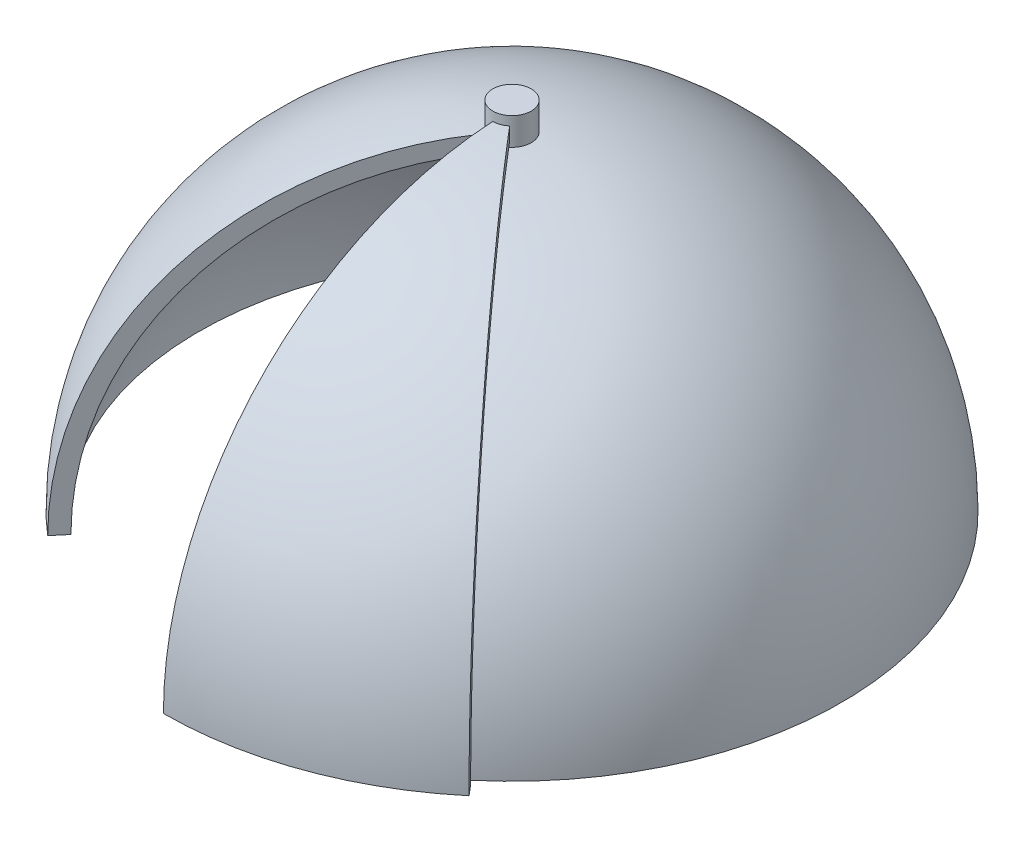
ISO-10303-21;
HEADER;
FILE_DESCRIPTION(('STEP AP214'),'2;1');
FILE_NAME('part.step','',(''),(''),'','','');
FILE_SCHEMA(('AUTOMOTIVE_DESIGN { 1 0 10303 214 1 1 1 1 }'));
ENDSEC;
DATA;
#1=APPLICATION_CONTEXT('core data for automotive mechanical design processes');
#2=APPLICATION_PROTOCOL_DEFINITION('international standard','automotive_design',2000,#1);
#3=PRODUCT_CONTEXT('',#1,'mechanical');
#4=PRODUCT('Part','Part','',(#3));
#5=PRODUCT_RELATED_PRODUCT_CATEGORY('part','',(#4));
#6=PRODUCT_DEFINITION_FORMATION('','',#4);
#7=PRODUCT_DEFINITION_CONTEXT('part definition',#1,'design');
#8=PRODUCT_DEFINITION('design','',#6,#7);
#9=PRODUCT_DEFINITION_SHAPE('','',#8);
#10=(LENGTH_UNIT() NAMED_UNIT(*) SI_UNIT(.MILLI.,.METRE.));
#11=(NAMED_UNIT(*) PLANE_ANGLE_UNIT() SI_UNIT($,.RADIAN.));
#12=(NAMED_UNIT(*) SI_UNIT($,.STERADIAN.) SOLID_ANGLE_UNIT());
#13=UNCERTAINTY_MEASURE_WITH_UNIT(LENGTH_MEASURE(1.E-05),#10,'distance_accuracy_value','');
#14=(GEOMETRIC_REPRESENTATION_CONTEXT(3) GLOBAL_UNCERTAINTY_ASSIGNED_CONTEXT((#13)) GLOBAL_UNIT_ASSIGNED_CONTEXT((#10,
#11,#12)) REPRESENTATION_CONTEXT('',''));
#15=CARTESIAN_POINT('',(0.,0.,0.));
#16=DIRECTION('',(0.,0.,1.));
#17=DIRECTION('',(1.,0.,0.));
#18=AXIS2_PLACEMENT_3D('',#15,#16,#17);
#19=CARTESIAN_POINT('',(0.,0.,0.));
#20=DIRECTION('',(0.,-1.,0.));
#21=DIRECTION('',(0.64278760968654,0.,0.766044443118977));
#22=AXIS2_PLACEMENT_3D('',#19,#20,#21);
#23=SPHERICAL_SURFACE('',#22,12210.9780211331);
#24=CARTESIAN_POINT('',(4.79826286122826E-13,12190.8975974944,-5.71834700308029E-13));
#25=DIRECTION('',(0.,-1.,0.));
#26=DIRECTION('',(0.,0.,-1.));
#27=AXIS2_PLACEMENT_3D('',#24,#25,#26);
#28=CIRCLE('',#27,700.);
#29=CARTESIAN_POINT('',(449.951326780579,12190.8975974944,536.231110183283));
#30=VERTEX_POINT('',#29);
#31=CARTESIAN_POINT('',(4.79826286122826E-13,12190.8975974944,699.999999999999));
#32=VERTEX_POINT('',#31);
#33=EDGE_CURVE('E78',#30,#32,#28,.T.);
#34=ORIENTED_EDGE('',*,*,#33,.F.);
#35=CARTESIAN_POINT('',(0.,0.,0.));
#36=DIRECTION('',(-0.766044443118977,0.,0.64278760968654));
#37=DIRECTION('',(-0.64278760968654,0.,-0.766044443118977));
#38=AXIS2_PLACEMENT_3D('',#35,#36,#37);
#39=CIRCLE('',#38,12210.9780211331);
#40=CARTESIAN_POINT('',(7849.065374139,0.,9354.15185813694));
#41=VERTEX_POINT('',#40);
#42=EDGE_CURVE('E122',#41,#30,#39,.T.);
#43=ORIENTED_EDGE('',*,*,#42,.F.);
#44=CARTESIAN_POINT('',(0.,0.,0.));
#45=DIRECTION('',(0.,-1.,0.));
#46=DIRECTION('',(0.,0.,-1.));
#47=AXIS2_PLACEMENT_3D('',#44,#45,#46);
#48=CIRCLE('',#47,12210.9780211331);
#49=CARTESIAN_POINT('',(0.,0.,12210.9780211331));
#50=VERTEX_POINT('',#49);
#51=EDGE_CURVE('E128',#41,#50,#48,.T.);
#52=ORIENTED_EDGE('',*,*,#51,.T.);
#53=CARTESIAN_POINT('',(0.,0.,0.));
#54=DIRECTION('',(-1.,0.,0.));
#55=DIRECTION('',(0.,0.,-1.));
#56=AXIS2_PLACEMENT_3D('',#53,#54,#55);
#57=CIRCLE('',#56,12210.9780211331);
#58=EDGE_CURVE('E106',#50,#32,#57,.T.);
#59=ORIENTED_EDGE('',*,*,#58,.T.);
#60=EDGE_LOOP('',(#34,#43,#52,#59));
#61=FACE_BOUND('',#60,.T.);
#62=ADVANCED_FACE('F55',(#61),#23,.F.);
#63=CARTESIAN_POINT('',(0.,0.,0.));
#64=DIRECTION('',(0.,-1.,0.));
#65=DIRECTION('',(-0.64278760968654,0.,-0.766044443118977));
#66=AXIS2_PLACEMENT_3D('',#63,#64,#65);
#67=SPHERICAL_SURFACE('',#66,12693.1418998015);
#68=CARTESIAN_POINT('',(4.9883403115345E-13,12673.8254401935,-5.94487248735391E-13));
#69=DIRECTION('',(0.,-1.,0.));
#70=DIRECTION('',(0.,0.,-1.));
#71=AXIS2_PLACEMENT_3D('',#68,#69,#70);
#72=CIRCLE('',#71,700.);
#73=CARTESIAN_POINT('',(4.9883403115345E-13,12673.8254401935,699.999999999999));
#74=VERTEX_POINT('',#73);
#75=CARTESIAN_POINT('',(449.951326780579,12673.8254401935,536.231110183283));
#76=VERTEX_POINT('',#75);
#77=EDGE_CURVE('E109',#74,#76,#72,.F.);
#78=ORIENTED_EDGE('',*,*,#77,.F.);
#79=CARTESIAN_POINT('',(0.,0.,0.));
#80=DIRECTION('',(1.,0.,0.));
#81=DIRECTION('',(0.,0.,-1.));
#82=AXIS2_PLACEMENT_3D('',#79,#80,#81);
#83=CIRCLE('',#82,12693.1418998015);
#84=CARTESIAN_POINT('',(0.,0.,12693.1418998015));
#85=VERTEX_POINT('',#84);
#86=EDGE_CURVE('E97',#74,#85,#83,.T.);
#87=ORIENTED_EDGE('',*,*,#86,.T.);
#88=CARTESIAN_POINT('',(0.,0.,0.));
#89=DIRECTION('',(0.,-1.,0.));
#90=DIRECTION('',(0.,0.,-1.));
#91=AXIS2_PLACEMENT_3D('',#88,#89,#90);
#92=CIRCLE('',#91,12693.1418998015);
#93=CARTESIAN_POINT('',(8158.99434118547,0.,9723.51081806358));
#94=VERTEX_POINT('',#93);
#95=EDGE_CURVE('E63',#94,#85,#92,.T.);
#96=ORIENTED_EDGE('',*,*,#95,.F.);
#97=CARTESIAN_POINT('',(0.,0.,0.));
#98=DIRECTION('',(0.766044443118977,0.,-0.64278760968654));
#99=DIRECTION('',(-0.64278760968654,0.,-0.766044443118977));
#100=AXIS2_PLACEMENT_3D('',#97,#98,#99);
#101=CIRCLE('',#100,12693.1418998015);
#102=EDGE_CURVE('E110',#76,#94,#101,.T.);
#103=ORIENTED_EDGE('',*,*,#102,.F.);
#104=EDGE_LOOP('',(#78,#87,#96,#103));
#105=FACE_BOUND('',#104,.T.);
#106=ADVANCED_FACE('F57',(#105),#67,.T.);
#107=CARTESIAN_POINT('',(0.,0.,0.));
#108=DIRECTION('',(0.766044443118977,0.,-0.64278760968654));
#109=DIRECTION('',(-0.64278760968654,0.,-0.766044443118977));
#110=AXIS2_PLACEMENT_3D('',#107,#108,#109);
#111=PLANE('',#110);
#112=ORIENTED_EDGE('',*,*,#42,.T.);
#113=DIRECTION('',(0.,-1.,0.));
#114=VECTOR('',#113,1.);
#115=CARTESIAN_POINT('',(449.951326780578,13000.,536.231110183284));
#116=LINE('',#115,#114);
#117=EDGE_CURVE('E70',#30,#76,#116,.F.);
#118=ORIENTED_EDGE('',*,*,#117,.T.);
#119=ORIENTED_EDGE('',*,*,#102,.T.);
#120=DIRECTION('',(-0.64278760968654,0.,-0.766044443118977));
#121=VECTOR('',#120,1.);
#122=CARTESIAN_POINT('',(7849.065374139,0.,9354.15185813694));
#123=LINE('',#122,#121);
#124=EDGE_CURVE('E125',#94,#41,#123,.T.);
#125=ORIENTED_EDGE('',*,*,#124,.T.);
#126=EDGE_LOOP('',(#112,#118,#119,#125));
#127=FACE_BOUND('',#126,.T.);
#128=ADVANCED_FACE('F132',(#127),#111,.T.);
#129=CARTESIAN_POINT('',(0.,0.,0.));
#130=DIRECTION('',(1.,0.,0.));
#131=DIRECTION('',(0.,0.,-1.));
#132=AXIS2_PLACEMENT_3D('',#129,#130,#131);
#133=PLANE('',#132);
#134=DIRECTION('',(0.,-1.,0.));
#135=VECTOR('',#134,1.);
#136=CARTESIAN_POINT('',(0.,13000.,699.999999999999));
#137=LINE('',#136,#135);
#138=EDGE_CURVE('E12',#32,#74,#137,.F.);
#139=ORIENTED_EDGE('',*,*,#138,.F.);
#140=ORIENTED_EDGE('',*,*,#58,.F.);
#141=DIRECTION('',(0.,0.,-1.));
#142=VECTOR('',#141,1.);
#143=CARTESIAN_POINT('',(0.,0.,12210.9780211331));
#144=LINE('',#143,#142);
#145=EDGE_CURVE('E102',#85,#50,#144,.T.);
#146=ORIENTED_EDGE('',*,*,#145,.F.);
#147=ORIENTED_EDGE('',*,*,#86,.F.);
#148=EDGE_LOOP('',(#139,#140,#146,#147));
#149=FACE_BOUND('',#148,.T.);
#150=ADVANCED_FACE('F99',(#149),#133,.F.);
#151=CARTESIAN_POINT('',(7849.065374139,0.,9354.15185813694));
#152=DIRECTION('',(0.,1.,0.));
#153=DIRECTION('',(0.,0.,1.));
#154=AXIS2_PLACEMENT_3D('',#151,#152,#153);
#155=PLANE('',#154);
#156=ORIENTED_EDGE('',*,*,#124,.F.);
#157=ORIENTED_EDGE('',*,*,#95,.T.);
#158=ORIENTED_EDGE('',*,*,#145,.T.);
#159=ORIENTED_EDGE('',*,*,#51,.F.);
#160=EDGE_LOOP('',(#156,#157,#158,#159));
#161=FACE_BOUND('',#160,.T.);
#162=ADVANCED_FACE('F131',(#161),#155,.F.);
#163=CARTESIAN_POINT('',(5.11672062677222E-13,13000.,-6.09787018925683E-13));
#164=DIRECTION('',(0.,-1.,0.));
#165=DIRECTION('',(0.,0.,-1.));
#166=AXIS2_PLACEMENT_3D('',#163,#164,#165);
#167=CYLINDRICAL_SURFACE('',#166,700.);
#168=ORIENTED_EDGE('',*,*,#117,.F.);
#169=ORIENTED_EDGE('',*,*,#33,.T.);
#170=ORIENTED_EDGE('',*,*,#138,.T.);
#171=ORIENTED_EDGE('',*,*,#77,.T.);
#172=EDGE_LOOP('',(#168,#169,#170,#171));
#173=FACE_BOUND('',#172,.T.);
#174=CARTESIAN_POINT('',(5.11672062677222E-13,13000.,-6.09787018925683E-13));
#175=DIRECTION('',(0.,1.,0.));
#176=DIRECTION('',(0.,0.,1.));
#177=AXIS2_PLACEMENT_3D('',#174,#175,#176);
#178=CIRCLE('',#177,700.);
#179=CARTESIAN_POINT('',(5.11672062677222E-13,13000.,699.999999999999));
#180=VERTEX_POINT('',#179);
#181=EDGE_CURVE('E112',#180,#180,#178,.T.);
#182=ORIENTED_EDGE('',*,*,#181,.F.);
#183=EDGE_LOOP('',(#182));
#184=FACE_BOUND('',#183,.T.);
#185=CARTESIAN_POINT('',(4.72312673240512E-13,12000.,-5.62880325162169E-13));
#186=DIRECTION('',(0.,1.,0.));
#187=DIRECTION('',(0.,0.,1.));
#188=AXIS2_PLACEMENT_3D('',#185,#186,#187);
#189=CIRCLE('',#188,700.);
#190=CARTESIAN_POINT('',(4.72312673240512E-13,12000.,699.999999999999));
#191=VERTEX_POINT('',#190);
#192=EDGE_CURVE('E161',#191,#191,#189,.T.);
#193=ORIENTED_EDGE('',*,*,#192,.T.);
#194=EDGE_LOOP('',(#193));
#195=FACE_BOUND('',#194,.T.);
#196=ADVANCED_FACE('F114',(#173,#184,#195),#167,.T.);
#197=CARTESIAN_POINT('',(5.11672062677222E-13,13000.,-6.09787018925683E-13));
#198=DIRECTION('',(0.,1.,0.));
#199=DIRECTION('',(0.,0.,1.));
#200=AXIS2_PLACEMENT_3D('',#197,#198,#199);
#201=PLANE('',#200);
#202=ORIENTED_EDGE('',*,*,#181,.T.);
#203=EDGE_LOOP('',(#202));
#204=FACE_BOUND('',#203,.T.);
#205=ADVANCED_FACE('F144',(#204),#201,.T.);
#206=CARTESIAN_POINT('',(4.72312673240512E-13,12000.,-5.62880325162169E-13));
#207=DIRECTION('',(0.,1.,0.));
#208=DIRECTION('',(0.,0.,1.));
#209=AXIS2_PLACEMENT_3D('',#206,#207,#208);
#210=PLANE('',#209);
#211=ORIENTED_EDGE('',*,*,#192,.F.);
#212=EDGE_LOOP('',(#211));
#213=FACE_BOUND('',#212,.T.);
#214=ADVANCED_FACE('F151',(#213),#210,.F.);
#215=CLOSED_SHELL('',(#62,#106,#128,#150,#162,#196,#205,#214));
#216=MANIFOLD_SOLID_BREP('B2',#215);
#217=CARTESIAN_POINT('',(0.,0.,0.));
#218=DIRECTION('',(0.,-1.,0.));
#219=DIRECTION('',(-0.64278760968653,0.,0.766044443118986));
#220=AXIS2_PLACEMENT_3D('',#217,#218,#219);
#221=SPHERICAL_SURFACE('',#220,11400.);
#222=CARTESIAN_POINT('',(0.,0.,0.));
#223=DIRECTION('',(-1.,0.,0.));
#224=DIRECTION('',(0.,0.,-1.));
#225=AXIS2_PLACEMENT_3D('',#222,#223,#224);
#226=CIRCLE('',#225,11400.);
#227=CARTESIAN_POINT('',(0.,0.,11400.));
#228=VERTEX_POINT('',#227);
#229=CARTESIAN_POINT('',(0.,11400.,0.));
#230=VERTEX_POINT('',#229);
#231=EDGE_CURVE('E251',#228,#230,#226,.T.);
#232=ORIENTED_EDGE('',*,*,#231,.T.);
#233=CARTESIAN_POINT('',(0.,0.,0.));
#234=DIRECTION('',(-0.766044443118986,0.,-0.64278760968653));
#235=DIRECTION('',(0.64278760968653,0.,-0.766044443118986));
#236=AXIS2_PLACEMENT_3D('',#233,#234,#235);
#237=CIRCLE('',#236,11400.);
#238=CARTESIAN_POINT('',(-7327.77875042644,0.,8732.90665155644));
#239=VERTEX_POINT('',#238);
#240=EDGE_CURVE('E257',#239,#230,#237,.T.);
#241=ORIENTED_EDGE('',*,*,#240,.F.);
#242=CARTESIAN_POINT('',(0.,0.,0.));
#243=DIRECTION('',(0.,-1.,0.));
#244=DIRECTION('',(0.,0.,-1.));
#245=AXIS2_PLACEMENT_3D('',#242,#243,#244);
#246=CIRCLE('',#245,11400.);
#247=EDGE_CURVE('E218',#239,#228,#246,.T.);
#248=ORIENTED_EDGE('',*,*,#247,.T.);
#249=EDGE_LOOP('',(#232,#241,#248));
#250=FACE_BOUND('',#249,.T.);
#251=ADVANCED_FACE('F209',(#250),#221,.F.);
#252=CARTESIAN_POINT('',(0.,0.,0.));
#253=DIRECTION('',(0.,-1.,0.));
#254=DIRECTION('',(0.64278760968653,0.,-0.766044443118986));
#255=AXIS2_PLACEMENT_3D('',#252,#253,#254);
#256=SPHERICAL_SURFACE('',#255,12000.);
#257=CARTESIAN_POINT('',(0.,0.,0.));
#258=DIRECTION('',(0.,-1.,0.));
#259=DIRECTION('',(0.,0.,-1.));
#260=AXIS2_PLACEMENT_3D('',#257,#258,#259);
#261=CIRCLE('',#260,12000.);
#262=CARTESIAN_POINT('',(-7713.45131623836,0.,9192.53331742783));
#263=VERTEX_POINT('',#262);
#264=CARTESIAN_POINT('',(0.,0.,12000.));
#265=VERTEX_POINT('',#264);
#266=EDGE_CURVE('E53',#263,#265,#261,.T.);
#267=ORIENTED_EDGE('',*,*,#266,.F.);
#268=CARTESIAN_POINT('',(0.,0.,0.));
#269=DIRECTION('',(0.766044443118986,0.,0.64278760968653));
#270=DIRECTION('',(0.64278760968653,0.,-0.766044443118986));
#271=AXIS2_PLACEMENT_3D('',#268,#269,#270);
#272=CIRCLE('',#271,12000.);
#273=CARTESIAN_POINT('',(4.72312673240512E-13,12000.,-5.6288032516217E-13));
#274=VERTEX_POINT('',#273);
#275=EDGE_CURVE('E247',#274,#263,#272,.T.);
#276=ORIENTED_EDGE('',*,*,#275,.F.);
#277=CARTESIAN_POINT('',(0.,0.,0.));
#278=DIRECTION('',(1.,0.,0.));
#279=DIRECTION('',(0.,0.,-1.));
#280=AXIS2_PLACEMENT_3D('',#277,#278,#279);
#281=CIRCLE('',#280,12000.);
#282=EDGE_CURVE('E246',#274,#265,#281,.T.);
#283=ORIENTED_EDGE('',*,*,#282,.T.);
#284=EDGE_LOOP('',(#267,#276,#283));
#285=FACE_BOUND('',#284,.T.);
#286=ADVANCED_FACE('F211',(#285),#256,.T.);
#287=CARTESIAN_POINT('',(-7327.77875042644,0.,8732.90665155644));
#288=DIRECTION('',(0.,1.,0.));
#289=DIRECTION('',(0.,0.,1.));
#290=AXIS2_PLACEMENT_3D('',#287,#288,#289);
#291=PLANE('',#290);
#292=DIRECTION('',(0.64278760968653,0.,-0.766044443118986));
#293=VECTOR('',#292,1.);
#294=CARTESIAN_POINT('',(-7327.77875042644,0.,8732.90665155644));
#295=LINE('',#294,#293);
#296=EDGE_CURVE('E245',#263,#239,#295,.T.);
#297=ORIENTED_EDGE('',*,*,#296,.F.);
#298=ORIENTED_EDGE('',*,*,#266,.T.);
#299=DIRECTION('',(0.,0.,-1.));
#300=VECTOR('',#299,1.);
#301=CARTESIAN_POINT('',(0.,0.,11400.));
#302=LINE('',#301,#300);
#303=EDGE_CURVE('E243',#265,#228,#302,.T.);
#304=ORIENTED_EDGE('',*,*,#303,.T.);
#305=ORIENTED_EDGE('',*,*,#247,.F.);
#306=EDGE_LOOP('',(#297,#298,#304,#305));
#307=FACE_BOUND('',#306,.T.);
#308=ADVANCED_FACE('F241',(#307),#291,.F.);
#309=CARTESIAN_POINT('',(0.,0.,0.));
#310=DIRECTION('',(0.766044443118986,0.,0.64278760968653));
#311=DIRECTION('',(0.64278760968653,0.,-0.766044443118986));
#312=AXIS2_PLACEMENT_3D('',#309,#310,#311);
#313=PLANE('',#312);
#314=ORIENTED_EDGE('',*,*,#240,.T.);
#315=DIRECTION('',(0.,1.,0.));
#316=VECTOR('',#315,1.);
#317=CARTESIAN_POINT('',(0.,11400.,0.));
#318=LINE('',#317,#316);
#319=EDGE_CURVE('E261',#230,#274,#318,.T.);
#320=ORIENTED_EDGE('',*,*,#319,.T.);
#321=ORIENTED_EDGE('',*,*,#275,.T.);
#322=ORIENTED_EDGE('',*,*,#296,.T.);
#323=EDGE_LOOP('',(#314,#320,#321,#322));
#324=FACE_BOUND('',#323,.T.);
#325=ADVANCED_FACE('F273',(#324),#313,.T.);
#326=CARTESIAN_POINT('',(0.,0.,0.));
#327=DIRECTION('',(1.,0.,0.));
#328=DIRECTION('',(0.,0.,-1.));
#329=AXIS2_PLACEMENT_3D('',#326,#327,#328);
#330=PLANE('',#329);
#331=ORIENTED_EDGE('',*,*,#231,.F.);
#332=ORIENTED_EDGE('',*,*,#303,.F.);
#333=ORIENTED_EDGE('',*,*,#282,.F.);
#334=ORIENTED_EDGE('',*,*,#319,.F.);
#335=EDGE_LOOP('',(#331,#332,#333,#334));
#336=FACE_BOUND('',#335,.T.);
#337=ADVANCED_FACE('F254',(#336),#330,.F.);
#338=CLOSED_SHELL('',(#251,#286,#308,#325,#337));
#339=MANIFOLD_SOLID_BREP('B6',#338);
#340=ADVANCED_BREP_SHAPE_REPRESENTATION('',(#18,#216,#339),#14);
#341=SHAPE_DEFINITION_REPRESENTATION(#9,#340);
ENDSEC;
END-ISO-10303-21;
